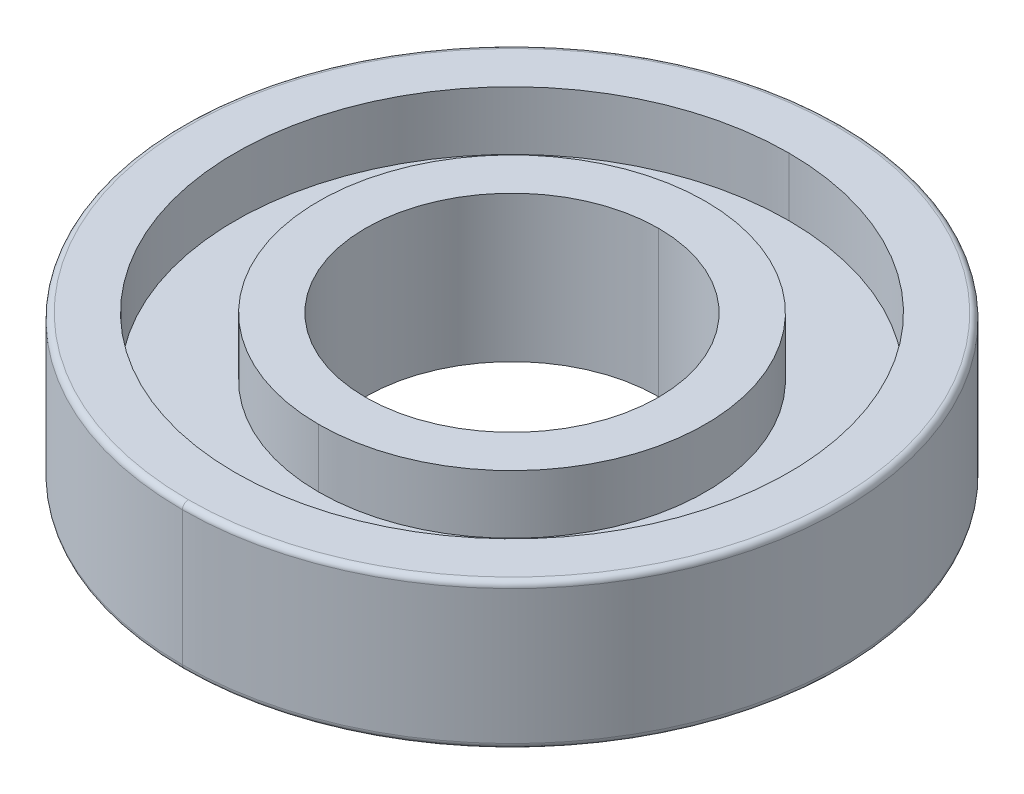
ISO-10303-21;
HEADER;
FILE_DESCRIPTION(('STEP AP214'),'2;1');
FILE_NAME('part.step','',(''),(''),'','','');
FILE_SCHEMA(('AUTOMOTIVE_DESIGN { 1 0 10303 214 1 1 1 1 }'));
ENDSEC;
DATA;
#1=APPLICATION_CONTEXT('core data for automotive mechanical design processes');
#2=APPLICATION_PROTOCOL_DEFINITION('international standard','automotive_design',2000,#1);
#3=PRODUCT_CONTEXT('',#1,'mechanical');
#4=PRODUCT('Part','Part','',(#3));
#5=PRODUCT_RELATED_PRODUCT_CATEGORY('part','',(#4));
#6=PRODUCT_DEFINITION_FORMATION('','',#4);
#7=PRODUCT_DEFINITION_CONTEXT('part definition',#1,'design');
#8=PRODUCT_DEFINITION('design','',#6,#7);
#9=PRODUCT_DEFINITION_SHAPE('','',#8);
#10=(LENGTH_UNIT() NAMED_UNIT(*) SI_UNIT(.MILLI.,.METRE.));
#11=(NAMED_UNIT(*) PLANE_ANGLE_UNIT() SI_UNIT($,.RADIAN.));
#12=(NAMED_UNIT(*) SI_UNIT($,.STERADIAN.) SOLID_ANGLE_UNIT());
#13=UNCERTAINTY_MEASURE_WITH_UNIT(LENGTH_MEASURE(1.E-05),#10,'distance_accuracy_value','');
#14=(GEOMETRIC_REPRESENTATION_CONTEXT(3) GLOBAL_UNCERTAINTY_ASSIGNED_CONTEXT((#13)) GLOBAL_UNIT_ASSIGNED_CONTEXT((#10,
#11,#12)) REPRESENTATION_CONTEXT('',''));
#15=CARTESIAN_POINT('',(0.,0.,0.));
#16=DIRECTION('',(0.,0.,1.));
#17=DIRECTION('',(1.,0.,0.));
#18=AXIS2_PLACEMENT_3D('',#15,#16,#17);
#19=CARTESIAN_POINT('',(0.,6.0706,0.));
#20=DIRECTION('',(0.,1.,0.));
#21=DIRECTION('',(0.,0.,1.));
#22=AXIS2_PLACEMENT_3D('',#19,#20,#21);
#23=TOROIDAL_SURFACE('',#22,14.0335,0.254);
#24=CARTESIAN_POINT('',(0.,6.0706,-14.0335));
#25=DIRECTION('',(1.,0.,0.));
#26=DIRECTION('',(0.,0.,-1.));
#27=AXIS2_PLACEMENT_3D('',#24,#25,#26);
#28=CIRCLE('',#27,0.254);
#29=CARTESIAN_POINT('',(0.,6.0706,-14.2875));
#30=VERTEX_POINT('',#29);
#31=CARTESIAN_POINT('',(0.,6.3246,-14.0335));
#32=VERTEX_POINT('',#31);
#33=EDGE_CURVE('E171',#30,#32,#28,.T.);
#34=ORIENTED_EDGE('',*,*,#33,.F.);
#35=CARTESIAN_POINT('',(0.,6.0706,0.));
#36=DIRECTION('',(0.,-1.,0.));
#37=DIRECTION('',(0.,0.,1.));
#38=AXIS2_PLACEMENT_3D('',#35,#36,#37);
#39=CIRCLE('',#38,14.2875);
#40=CARTESIAN_POINT('',(0.,6.0706,14.2875));
#41=VERTEX_POINT('',#40);
#42=EDGE_CURVE('E144',#41,#30,#39,.T.);
#43=ORIENTED_EDGE('',*,*,#42,.F.);
#44=CARTESIAN_POINT('',(0.,6.0706,14.0335));
#45=DIRECTION('',(-1.,0.,0.));
#46=DIRECTION('',(0.,0.,1.));
#47=AXIS2_PLACEMENT_3D('',#44,#45,#46);
#48=CIRCLE('',#47,0.254);
#49=CARTESIAN_POINT('',(0.,6.3246,14.0335));
#50=VERTEX_POINT('',#49);
#51=EDGE_CURVE('E180',#41,#50,#48,.T.);
#52=ORIENTED_EDGE('',*,*,#51,.T.);
#53=CARTESIAN_POINT('',(0.,6.3246,0.));
#54=DIRECTION('',(0.,1.,0.));
#55=DIRECTION('',(0.,0.,1.));
#56=AXIS2_PLACEMENT_3D('',#53,#54,#55);
#57=CIRCLE('',#56,14.0335);
#58=EDGE_CURVE('E172',#32,#50,#57,.T.);
#59=ORIENTED_EDGE('',*,*,#58,.F.);
#60=EDGE_LOOP('',(#34,#43,#52,#59));
#61=FACE_BOUND('',#60,.T.);
#62=ADVANCED_FACE('F16',(#61),#23,.T.);
#63=CARTESIAN_POINT('',(0.,0.254,0.));
#64=DIRECTION('',(0.,1.,0.));
#65=DIRECTION('',(0.,0.,1.));
#66=AXIS2_PLACEMENT_3D('',#63,#64,#65);
#67=TOROIDAL_SURFACE('',#66,14.0335,0.254);
#68=CARTESIAN_POINT('',(0.,0.254,-14.0335));
#69=DIRECTION('',(1.,0.,0.));
#70=DIRECTION('',(0.,0.,-1.));
#71=AXIS2_PLACEMENT_3D('',#68,#69,#70);
#72=CIRCLE('',#71,0.254);
#73=CARTESIAN_POINT('',(0.,0.,-14.0335));
#74=VERTEX_POINT('',#73);
#75=CARTESIAN_POINT('',(0.,0.254,-14.2875));
#76=VERTEX_POINT('',#75);
#77=EDGE_CURVE('E246',#74,#76,#72,.T.);
#78=ORIENTED_EDGE('',*,*,#77,.F.);
#79=CARTESIAN_POINT('',(0.,0.,0.));
#80=DIRECTION('',(0.,-1.,0.));
#81=DIRECTION('',(0.,0.,1.));
#82=AXIS2_PLACEMENT_3D('',#79,#80,#81);
#83=CIRCLE('',#82,14.0335);
#84=CARTESIAN_POINT('',(0.,0.,14.0335));
#85=VERTEX_POINT('',#84);
#86=EDGE_CURVE('E200',#85,#74,#83,.T.);
#87=ORIENTED_EDGE('',*,*,#86,.F.);
#88=CARTESIAN_POINT('',(0.,0.254,14.0335));
#89=DIRECTION('',(-1.,0.,0.));
#90=DIRECTION('',(0.,0.,1.));
#91=AXIS2_PLACEMENT_3D('',#88,#89,#90);
#92=CIRCLE('',#91,0.254);
#93=CARTESIAN_POINT('',(0.,0.254,14.2875));
#94=VERTEX_POINT('',#93);
#95=EDGE_CURVE('E241',#85,#94,#92,.T.);
#96=ORIENTED_EDGE('',*,*,#95,.T.);
#97=CARTESIAN_POINT('',(0.,0.254,0.));
#98=DIRECTION('',(0.,1.,0.));
#99=DIRECTION('',(0.,0.,1.));
#100=AXIS2_PLACEMENT_3D('',#97,#98,#99);
#101=CIRCLE('',#100,14.2875);
#102=EDGE_CURVE('E156',#76,#94,#101,.T.);
#103=ORIENTED_EDGE('',*,*,#102,.F.);
#104=EDGE_LOOP('',(#78,#87,#96,#103));
#105=FACE_BOUND('',#104,.T.);
#106=ADVANCED_FACE('F330',(#105),#67,.T.);
#107=CARTESIAN_POINT('',(0.,2.54,0.));
#108=DIRECTION('',(0.,-1.,0.));
#109=DIRECTION('',(0.,0.,-1.));
#110=AXIS2_PLACEMENT_3D('',#107,#108,#109);
#111=CYLINDRICAL_SURFACE('',#110,8.382);
#112=DIRECTION('',(0.,-1.,0.));
#113=VECTOR('',#112,1.);
#114=CARTESIAN_POINT('',(0.,2.54,8.382));
#115=LINE('',#114,#113);
#116=CARTESIAN_POINT('',(0.,2.54,8.382));
#117=VERTEX_POINT('',#116);
#118=CARTESIAN_POINT('',(0.,0.,8.382));
#119=VERTEX_POINT('',#118);
#120=EDGE_CURVE('E192',#117,#119,#115,.T.);
#121=ORIENTED_EDGE('',*,*,#120,.F.);
#122=CARTESIAN_POINT('',(0.,2.54,0.));
#123=DIRECTION('',(0.,-1.,0.));
#124=DIRECTION('',(0.,0.,-1.));
#125=AXIS2_PLACEMENT_3D('',#122,#123,#124);
#126=CIRCLE('',#125,8.382);
#127=CARTESIAN_POINT('',(0.,2.54,-8.382));
#128=VERTEX_POINT('',#127);
#129=EDGE_CURVE('E11',#117,#128,#126,.T.);
#130=ORIENTED_EDGE('',*,*,#129,.T.);
#131=DIRECTION('',(0.,-1.,0.));
#132=VECTOR('',#131,1.);
#133=CARTESIAN_POINT('',(0.,2.54,-8.382));
#134=LINE('',#133,#132);
#135=CARTESIAN_POINT('',(0.,0.,-8.382));
#136=VERTEX_POINT('',#135);
#137=EDGE_CURVE('E215',#128,#136,#134,.T.);
#138=ORIENTED_EDGE('',*,*,#137,.T.);
#139=CARTESIAN_POINT('',(0.,0.,0.));
#140=DIRECTION('',(0.,-1.,0.));
#141=DIRECTION('',(0.,0.,-1.));
#142=AXIS2_PLACEMENT_3D('',#139,#140,#141);
#143=CIRCLE('',#142,8.382);
#144=EDGE_CURVE('E168',#119,#136,#143,.T.);
#145=ORIENTED_EDGE('',*,*,#144,.F.);
#146=EDGE_LOOP('',(#121,#130,#138,#145));
#147=FACE_BOUND('',#146,.T.);
#148=ADVANCED_FACE('F350',(#147),#111,.T.);
#149=CARTESIAN_POINT('',(0.,2.54,0.));
#150=DIRECTION('',(0.,-1.,0.));
#151=DIRECTION('',(0.,0.,-1.));
#152=AXIS2_PLACEMENT_3D('',#149,#150,#151);
#153=PLANE('',#152);
#154=CARTESIAN_POINT('',(0.,2.54,0.));
#155=DIRECTION('',(0.,-1.,0.));
#156=DIRECTION('',(0.,0.,-1.));
#157=AXIS2_PLACEMENT_3D('',#154,#155,#156);
#158=CIRCLE('',#157,8.382);
#159=EDGE_CURVE('E197',#128,#117,#158,.T.);
#160=ORIENTED_EDGE('',*,*,#159,.F.);
#161=ORIENTED_EDGE('',*,*,#129,.F.);
#162=EDGE_LOOP('',(#160,#161));
#163=FACE_BOUND('',#162,.T.);
#164=CARTESIAN_POINT('',(0.,2.54,0.));
#165=DIRECTION('',(0.,-1.,0.));
#166=DIRECTION('',(0.,0.,-1.));
#167=AXIS2_PLACEMENT_3D('',#164,#165,#166);
#168=CIRCLE('',#167,12.0015);
#169=CARTESIAN_POINT('',(0.,2.54,-12.0015));
#170=VERTEX_POINT('',#169);
#171=CARTESIAN_POINT('',(0.,2.54,12.0015));
#172=VERTEX_POINT('',#171);
#173=EDGE_CURVE('E27',#170,#172,#168,.T.);
#174=ORIENTED_EDGE('',*,*,#173,.T.);
#175=CARTESIAN_POINT('',(0.,2.54,0.));
#176=DIRECTION('',(0.,-1.,0.));
#177=DIRECTION('',(0.,0.,-1.));
#178=AXIS2_PLACEMENT_3D('',#175,#176,#177);
#179=CIRCLE('',#178,12.0015);
#180=EDGE_CURVE('E210',#172,#170,#179,.T.);
#181=ORIENTED_EDGE('',*,*,#180,.T.);
#182=EDGE_LOOP('',(#174,#181));
#183=FACE_BOUND('',#182,.T.);
#184=ADVANCED_FACE('F364',(#163,#183),#153,.T.);
#185=CARTESIAN_POINT('',(0.,2.54,0.));
#186=DIRECTION('',(0.,-1.,0.));
#187=DIRECTION('',(0.,0.,-1.));
#188=AXIS2_PLACEMENT_3D('',#185,#186,#187);
#189=CYLINDRICAL_SURFACE('',#188,12.0015);
#190=DIRECTION('',(0.,-1.,0.));
#191=VECTOR('',#190,1.);
#192=CARTESIAN_POINT('',(0.,2.54,12.0015));
#193=LINE('',#192,#191);
#194=CARTESIAN_POINT('',(0.,0.,12.0015));
#195=VERTEX_POINT('',#194);
#196=EDGE_CURVE('E214',#172,#195,#193,.T.);
#197=ORIENTED_EDGE('',*,*,#196,.F.);
#198=ORIENTED_EDGE('',*,*,#173,.F.);
#199=DIRECTION('',(0.,-1.,0.));
#200=VECTOR('',#199,1.);
#201=CARTESIAN_POINT('',(0.,2.54,-12.0015));
#202=LINE('',#201,#200);
#203=CARTESIAN_POINT('',(0.,0.,-12.0015));
#204=VERTEX_POINT('',#203);
#205=EDGE_CURVE('E216',#170,#204,#202,.T.);
#206=ORIENTED_EDGE('',*,*,#205,.T.);
#207=CARTESIAN_POINT('',(0.,0.,0.));
#208=DIRECTION('',(0.,-1.,0.));
#209=DIRECTION('',(0.,0.,-1.));
#210=AXIS2_PLACEMENT_3D('',#207,#208,#209);
#211=CIRCLE('',#210,12.0015);
#212=EDGE_CURVE('E157',#204,#195,#211,.T.);
#213=ORIENTED_EDGE('',*,*,#212,.T.);
#214=EDGE_LOOP('',(#197,#198,#206,#213));
#215=FACE_BOUND('',#214,.T.);
#216=ADVANCED_FACE('F319',(#215),#189,.F.);
#217=CARTESIAN_POINT('',(0.,3.7846,0.));
#218=DIRECTION('',(0.,1.,0.));
#219=DIRECTION('',(0.,0.,1.));
#220=AXIS2_PLACEMENT_3D('',#217,#218,#219);
#221=CYLINDRICAL_SURFACE('',#220,8.382);
#222=DIRECTION('',(0.,1.,0.));
#223=VECTOR('',#222,1.);
#224=CARTESIAN_POINT('',(0.,3.7846,-8.382));
#225=LINE('',#224,#223);
#226=CARTESIAN_POINT('',(0.,3.7846,-8.382));
#227=VERTEX_POINT('',#226);
#228=CARTESIAN_POINT('',(0.,6.3246,-8.382));
#229=VERTEX_POINT('',#228);
#230=EDGE_CURVE('E222',#227,#229,#225,.T.);
#231=ORIENTED_EDGE('',*,*,#230,.F.);
#232=CARTESIAN_POINT('',(0.,3.7846,0.));
#233=DIRECTION('',(0.,1.,0.));
#234=DIRECTION('',(0.,0.,1.));
#235=AXIS2_PLACEMENT_3D('',#232,#233,#234);
#236=CIRCLE('',#235,8.382);
#237=CARTESIAN_POINT('',(0.,3.7846,8.382));
#238=VERTEX_POINT('',#237);
#239=EDGE_CURVE('E188',#227,#238,#236,.T.);
#240=ORIENTED_EDGE('',*,*,#239,.T.);
#241=DIRECTION('',(0.,1.,0.));
#242=VECTOR('',#241,1.);
#243=CARTESIAN_POINT('',(0.,3.7846,8.382));
#244=LINE('',#243,#242);
#245=CARTESIAN_POINT('',(0.,6.3246,8.382));
#246=VERTEX_POINT('',#245);
#247=EDGE_CURVE('E233',#238,#246,#244,.T.);
#248=ORIENTED_EDGE('',*,*,#247,.T.);
#249=CARTESIAN_POINT('',(0.,6.3246,0.));
#250=DIRECTION('',(0.,1.,0.));
#251=DIRECTION('',(0.,0.,1.));
#252=AXIS2_PLACEMENT_3D('',#249,#250,#251);
#253=CIRCLE('',#252,8.382);
#254=EDGE_CURVE('E288',#229,#246,#253,.T.);
#255=ORIENTED_EDGE('',*,*,#254,.F.);
#256=EDGE_LOOP('',(#231,#240,#248,#255));
#257=FACE_BOUND('',#256,.T.);
#258=ADVANCED_FACE('F363',(#257),#221,.T.);
#259=CARTESIAN_POINT('',(0.,3.7846,0.));
#260=DIRECTION('',(0.,1.,0.));
#261=DIRECTION('',(1.,0.,0.));
#262=AXIS2_PLACEMENT_3D('',#259,#260,#261);
#263=PLANE('',#262);
#264=CARTESIAN_POINT('',(0.,3.7846,0.));
#265=DIRECTION('',(0.,1.,0.));
#266=DIRECTION('',(0.,0.,1.));
#267=AXIS2_PLACEMENT_3D('',#264,#265,#266);
#268=CIRCLE('',#267,8.382);
#269=EDGE_CURVE('E219',#238,#227,#268,.T.);
#270=ORIENTED_EDGE('',*,*,#269,.F.);
#271=ORIENTED_EDGE('',*,*,#239,.F.);
#272=EDGE_LOOP('',(#270,#271));
#273=FACE_BOUND('',#272,.T.);
#274=CARTESIAN_POINT('',(0.,3.7846,0.));
#275=DIRECTION('',(0.,1.,0.));
#276=DIRECTION('',(0.,0.,1.));
#277=AXIS2_PLACEMENT_3D('',#274,#275,#276);
#278=CIRCLE('',#277,12.0015);
#279=CARTESIAN_POINT('',(0.,3.7846,12.0015));
#280=VERTEX_POINT('',#279);
#281=CARTESIAN_POINT('',(0.,3.7846,-12.0015));
#282=VERTEX_POINT('',#281);
#283=EDGE_CURVE('E191',#280,#282,#278,.T.);
#284=ORIENTED_EDGE('',*,*,#283,.T.);
#285=CARTESIAN_POINT('',(0.,3.7846,0.));
#286=DIRECTION('',(0.,1.,0.));
#287=DIRECTION('',(0.,0.,1.));
#288=AXIS2_PLACEMENT_3D('',#285,#286,#287);
#289=CIRCLE('',#288,12.0015);
#290=EDGE_CURVE('E206',#282,#280,#289,.T.);
#291=ORIENTED_EDGE('',*,*,#290,.T.);
#292=EDGE_LOOP('',(#284,#291));
#293=FACE_BOUND('',#292,.T.);
#294=ADVANCED_FACE('F357',(#273,#293),#263,.T.);
#295=CARTESIAN_POINT('',(0.,3.7846,0.));
#296=DIRECTION('',(0.,1.,0.));
#297=DIRECTION('',(0.,0.,1.));
#298=AXIS2_PLACEMENT_3D('',#295,#296,#297);
#299=CYLINDRICAL_SURFACE('',#298,12.0015);
#300=DIRECTION('',(0.,1.,0.));
#301=VECTOR('',#300,1.);
#302=CARTESIAN_POINT('',(0.,3.7846,-12.0015));
#303=LINE('',#302,#301);
#304=CARTESIAN_POINT('',(0.,6.3246,-12.0015));
#305=VERTEX_POINT('',#304);
#306=EDGE_CURVE('E201',#282,#305,#303,.T.);
#307=ORIENTED_EDGE('',*,*,#306,.F.);
#308=ORIENTED_EDGE('',*,*,#283,.F.);
#309=DIRECTION('',(0.,1.,0.));
#310=VECTOR('',#309,1.);
#311=CARTESIAN_POINT('',(0.,3.7846,12.0015));
#312=LINE('',#311,#310);
#313=CARTESIAN_POINT('',(0.,6.3246,12.0015));
#314=VERTEX_POINT('',#313);
#315=EDGE_CURVE('E259',#280,#314,#312,.T.);
#316=ORIENTED_EDGE('',*,*,#315,.T.);
#317=CARTESIAN_POINT('',(0.,6.3246,0.));
#318=DIRECTION('',(0.,1.,0.));
#319=DIRECTION('',(0.,0.,1.));
#320=AXIS2_PLACEMENT_3D('',#317,#318,#319);
#321=CIRCLE('',#320,12.0015);
#322=EDGE_CURVE('E209',#314,#305,#321,.T.);
#323=ORIENTED_EDGE('',*,*,#322,.T.);
#324=EDGE_LOOP('',(#307,#308,#316,#323));
#325=FACE_BOUND('',#324,.T.);
#326=ADVANCED_FACE('F353',(#325),#299,.F.);
#327=CARTESIAN_POINT('',(0.,6.3246,0.));
#328=DIRECTION('',(0.,-1.,0.));
#329=DIRECTION('',(0.,0.,-1.));
#330=AXIS2_PLACEMENT_3D('',#327,#328,#329);
#331=CYLINDRICAL_SURFACE('',#330,6.35);
#332=DIRECTION('',(0.,-1.,0.));
#333=VECTOR('',#332,1.);
#334=CARTESIAN_POINT('',(0.,6.3246,6.35));
#335=LINE('',#334,#333);
#336=CARTESIAN_POINT('',(0.,6.3246,6.35));
#337=VERTEX_POINT('',#336);
#338=CARTESIAN_POINT('',(0.,0.,6.35));
#339=VERTEX_POINT('',#338);
#340=EDGE_CURVE('E247',#337,#339,#335,.T.);
#341=ORIENTED_EDGE('',*,*,#340,.F.);
#342=CARTESIAN_POINT('',(0.,6.3246,0.));
#343=DIRECTION('',(0.,1.,0.));
#344=DIRECTION('',(0.,0.,1.));
#345=AXIS2_PLACEMENT_3D('',#342,#343,#344);
#346=CIRCLE('',#345,6.35);
#347=CARTESIAN_POINT('',(0.,6.3246,-6.35));
#348=VERTEX_POINT('',#347);
#349=EDGE_CURVE('E20',#337,#348,#346,.T.);
#350=ORIENTED_EDGE('',*,*,#349,.T.);
#351=DIRECTION('',(0.,-1.,0.));
#352=VECTOR('',#351,1.);
#353=CARTESIAN_POINT('',(0.,6.3246,-6.35));
#354=LINE('',#353,#352);
#355=CARTESIAN_POINT('',(0.,0.,-6.35));
#356=VERTEX_POINT('',#355);
#357=EDGE_CURVE('E271',#348,#356,#354,.T.);
#358=ORIENTED_EDGE('',*,*,#357,.T.);
#359=CARTESIAN_POINT('',(0.,0.,0.));
#360=DIRECTION('',(0.,1.,0.));
#361=DIRECTION('',(0.,0.,1.));
#362=AXIS2_PLACEMENT_3D('',#359,#360,#361);
#363=CIRCLE('',#362,6.35);
#364=EDGE_CURVE('E41',#339,#356,#363,.T.);
#365=ORIENTED_EDGE('',*,*,#364,.F.);
#366=EDGE_LOOP('',(#341,#350,#358,#365));
#367=FACE_BOUND('',#366,.T.);
#368=ADVANCED_FACE('F356',(#367),#331,.F.);
#369=CARTESIAN_POINT('',(0.,6.3246,0.));
#370=DIRECTION('',(0.,-1.,0.));
#371=DIRECTION('',(0.,0.,-1.));
#372=AXIS2_PLACEMENT_3D('',#369,#370,#371);
#373=CYLINDRICAL_SURFACE('',#372,14.2875);
#374=DIRECTION('',(0.,-1.,0.));
#375=VECTOR('',#374,1.);
#376=CARTESIAN_POINT('',(0.,6.3246,14.2875));
#377=LINE('',#376,#375);
#378=EDGE_CURVE('E150',#41,#94,#377,.T.);
#379=ORIENTED_EDGE('',*,*,#378,.F.);
#380=ORIENTED_EDGE('',*,*,#42,.T.);
#381=DIRECTION('',(0.,-1.,0.));
#382=VECTOR('',#381,1.);
#383=CARTESIAN_POINT('',(0.,6.3246,-14.2875));
#384=LINE('',#383,#382);
#385=EDGE_CURVE('E147',#30,#76,#384,.T.);
#386=ORIENTED_EDGE('',*,*,#385,.T.);
#387=ORIENTED_EDGE('',*,*,#102,.T.);
#388=EDGE_LOOP('',(#379,#380,#386,#387));
#389=FACE_BOUND('',#388,.T.);
#390=ADVANCED_FACE('F146',(#389),#373,.T.);
#391=CARTESIAN_POINT('',(0.,0.,0.));
#392=DIRECTION('',(0.,1.,0.));
#393=DIRECTION('',(1.,0.,0.));
#394=AXIS2_PLACEMENT_3D('',#391,#392,#393);
#395=PLANE('',#394);
#396=ORIENTED_EDGE('',*,*,#212,.F.);
#397=CARTESIAN_POINT('',(0.,0.,0.));
#398=DIRECTION('',(0.,-1.,0.));
#399=DIRECTION('',(0.,0.,-1.));
#400=AXIS2_PLACEMENT_3D('',#397,#398,#399);
#401=CIRCLE('',#400,12.0015);
#402=EDGE_CURVE('E220',#195,#204,#401,.T.);
#403=ORIENTED_EDGE('',*,*,#402,.F.);
#404=EDGE_LOOP('',(#396,#403));
#405=FACE_BOUND('',#404,.T.);
#406=ORIENTED_EDGE('',*,*,#86,.T.);
#407=CARTESIAN_POINT('',(0.,0.,0.));
#408=DIRECTION('',(0.,-1.,0.));
#409=DIRECTION('',(0.,0.,1.));
#410=AXIS2_PLACEMENT_3D('',#407,#408,#409);
#411=CIRCLE('',#410,14.0335);
#412=EDGE_CURVE('E262',#74,#85,#411,.T.);
#413=ORIENTED_EDGE('',*,*,#412,.T.);
#414=EDGE_LOOP('',(#406,#413));
#415=FACE_BOUND('',#414,.T.);
#416=ADVANCED_FACE('F321',(#405,#415),#395,.F.);
#417=CARTESIAN_POINT('',(0.,6.3246,0.));
#418=DIRECTION('',(0.,1.,0.));
#419=DIRECTION('',(1.,0.,0.));
#420=AXIS2_PLACEMENT_3D('',#417,#418,#419);
#421=PLANE('',#420);
#422=ORIENTED_EDGE('',*,*,#322,.F.);
#423=CARTESIAN_POINT('',(0.,6.3246,0.));
#424=DIRECTION('',(0.,1.,0.));
#425=DIRECTION('',(0.,0.,1.));
#426=AXIS2_PLACEMENT_3D('',#423,#424,#425);
#427=CIRCLE('',#426,12.0015);
#428=EDGE_CURVE('E205',#305,#314,#427,.T.);
#429=ORIENTED_EDGE('',*,*,#428,.F.);
#430=EDGE_LOOP('',(#422,#429));
#431=FACE_BOUND('',#430,.T.);
#432=CARTESIAN_POINT('',(0.,6.3246,0.));
#433=DIRECTION('',(0.,1.,0.));
#434=DIRECTION('',(0.,0.,1.));
#435=AXIS2_PLACEMENT_3D('',#432,#433,#434);
#436=CIRCLE('',#435,14.0335);
#437=EDGE_CURVE('E177',#50,#32,#436,.T.);
#438=ORIENTED_EDGE('',*,*,#437,.T.);
#439=ORIENTED_EDGE('',*,*,#58,.T.);
#440=EDGE_LOOP('',(#438,#439));
#441=FACE_BOUND('',#440,.T.);
#442=ADVANCED_FACE('F324',(#431,#441),#421,.T.);
#443=CARTESIAN_POINT('',(0.,6.3246,0.));
#444=DIRECTION('',(0.,1.,0.));
#445=DIRECTION('',(1.,0.,0.));
#446=AXIS2_PLACEMENT_3D('',#443,#444,#445);
#447=PLANE('',#446);
#448=CARTESIAN_POINT('',(0.,6.3246,0.));
#449=DIRECTION('',(0.,1.,0.));
#450=DIRECTION('',(0.,0.,1.));
#451=AXIS2_PLACEMENT_3D('',#448,#449,#450);
#452=CIRCLE('',#451,6.35);
#453=EDGE_CURVE('E252',#348,#337,#452,.T.);
#454=ORIENTED_EDGE('',*,*,#453,.F.);
#455=ORIENTED_EDGE('',*,*,#349,.F.);
#456=EDGE_LOOP('',(#454,#455));
#457=FACE_BOUND('',#456,.T.);
#458=CARTESIAN_POINT('',(0.,6.3246,0.));
#459=DIRECTION('',(0.,1.,0.));
#460=DIRECTION('',(0.,0.,1.));
#461=AXIS2_PLACEMENT_3D('',#458,#459,#460);
#462=CIRCLE('',#461,8.382);
#463=EDGE_CURVE('E226',#246,#229,#462,.T.);
#464=ORIENTED_EDGE('',*,*,#463,.T.);
#465=ORIENTED_EDGE('',*,*,#254,.T.);
#466=EDGE_LOOP('',(#464,#465));
#467=FACE_BOUND('',#466,.T.);
#468=ADVANCED_FACE('F402',(#457,#467),#447,.T.);
#469=CARTESIAN_POINT('',(0.,0.,0.));
#470=DIRECTION('',(0.,1.,0.));
#471=DIRECTION('',(1.,0.,0.));
#472=AXIS2_PLACEMENT_3D('',#469,#470,#471);
#473=PLANE('',#472);
#474=CARTESIAN_POINT('',(0.,0.,0.));
#475=DIRECTION('',(0.,1.,0.));
#476=DIRECTION('',(0.,0.,1.));
#477=AXIS2_PLACEMENT_3D('',#474,#475,#476);
#478=CIRCLE('',#477,6.35);
#479=EDGE_CURVE('E251',#356,#339,#478,.T.);
#480=ORIENTED_EDGE('',*,*,#479,.T.);
#481=ORIENTED_EDGE('',*,*,#364,.T.);
#482=EDGE_LOOP('',(#480,#481));
#483=FACE_BOUND('',#482,.T.);
#484=CARTESIAN_POINT('',(0.,0.,0.));
#485=DIRECTION('',(0.,-1.,0.));
#486=DIRECTION('',(0.,0.,-1.));
#487=AXIS2_PLACEMENT_3D('',#484,#485,#486);
#488=CIRCLE('',#487,8.382);
#489=EDGE_CURVE('E196',#136,#119,#488,.T.);
#490=ORIENTED_EDGE('',*,*,#489,.T.);
#491=ORIENTED_EDGE('',*,*,#144,.T.);
#492=EDGE_LOOP('',(#490,#491));
#493=FACE_BOUND('',#492,.T.);
#494=ADVANCED_FACE('F18',(#483,#493),#473,.F.);
#495=CARTESIAN_POINT('',(0.,6.3246,0.));
#496=DIRECTION('',(0.,-1.,0.));
#497=DIRECTION('',(0.,0.,-1.));
#498=AXIS2_PLACEMENT_3D('',#495,#496,#497);
#499=CYLINDRICAL_SURFACE('',#498,14.2875);
#500=CARTESIAN_POINT('',(0.,6.0706,0.));
#501=DIRECTION('',(0.,-1.,0.));
#502=DIRECTION('',(0.,0.,1.));
#503=AXIS2_PLACEMENT_3D('',#500,#501,#502);
#504=CIRCLE('',#503,14.2875);
#505=EDGE_CURVE('E163',#30,#41,#504,.T.);
#506=ORIENTED_EDGE('',*,*,#505,.T.);
#507=ORIENTED_EDGE('',*,*,#378,.T.);
#508=CARTESIAN_POINT('',(0.,0.254,0.));
#509=DIRECTION('',(0.,1.,0.));
#510=DIRECTION('',(0.,0.,1.));
#511=AXIS2_PLACEMENT_3D('',#508,#509,#510);
#512=CIRCLE('',#511,14.2875);
#513=EDGE_CURVE('E165',#94,#76,#512,.T.);
#514=ORIENTED_EDGE('',*,*,#513,.T.);
#515=ORIENTED_EDGE('',*,*,#385,.F.);
#516=EDGE_LOOP('',(#506,#507,#514,#515));
#517=FACE_BOUND('',#516,.T.);
#518=ADVANCED_FACE('F161',(#517),#499,.T.);
#519=CARTESIAN_POINT('',(0.,6.3246,0.));
#520=DIRECTION('',(0.,-1.,0.));
#521=DIRECTION('',(0.,0.,-1.));
#522=AXIS2_PLACEMENT_3D('',#519,#520,#521);
#523=CYLINDRICAL_SURFACE('',#522,6.35);
#524=ORIENTED_EDGE('',*,*,#453,.T.);
#525=ORIENTED_EDGE('',*,*,#340,.T.);
#526=ORIENTED_EDGE('',*,*,#479,.F.);
#527=ORIENTED_EDGE('',*,*,#357,.F.);
#528=EDGE_LOOP('',(#524,#525,#526,#527));
#529=FACE_BOUND('',#528,.T.);
#530=ADVANCED_FACE('F368',(#529),#523,.F.);
#531=CARTESIAN_POINT('',(0.,3.7846,0.));
#532=DIRECTION('',(0.,1.,0.));
#533=DIRECTION('',(0.,0.,1.));
#534=AXIS2_PLACEMENT_3D('',#531,#532,#533);
#535=CYLINDRICAL_SURFACE('',#534,12.0015);
#536=ORIENTED_EDGE('',*,*,#290,.F.);
#537=ORIENTED_EDGE('',*,*,#306,.T.);
#538=ORIENTED_EDGE('',*,*,#428,.T.);
#539=ORIENTED_EDGE('',*,*,#315,.F.);
#540=EDGE_LOOP('',(#536,#537,#538,#539));
#541=FACE_BOUND('',#540,.T.);
#542=ADVANCED_FACE('F365',(#541),#535,.F.);
#543=CARTESIAN_POINT('',(0.,3.7846,0.));
#544=DIRECTION('',(0.,1.,0.));
#545=DIRECTION('',(0.,0.,1.));
#546=AXIS2_PLACEMENT_3D('',#543,#544,#545);
#547=CYLINDRICAL_SURFACE('',#546,8.382);
#548=ORIENTED_EDGE('',*,*,#269,.T.);
#549=ORIENTED_EDGE('',*,*,#230,.T.);
#550=ORIENTED_EDGE('',*,*,#463,.F.);
#551=ORIENTED_EDGE('',*,*,#247,.F.);
#552=EDGE_LOOP('',(#548,#549,#550,#551));
#553=FACE_BOUND('',#552,.T.);
#554=ADVANCED_FACE('F367',(#553),#547,.T.);
#555=CARTESIAN_POINT('',(0.,2.54,0.));
#556=DIRECTION('',(0.,-1.,0.));
#557=DIRECTION('',(0.,0.,-1.));
#558=AXIS2_PLACEMENT_3D('',#555,#556,#557);
#559=CYLINDRICAL_SURFACE('',#558,12.0015);
#560=ORIENTED_EDGE('',*,*,#180,.F.);
#561=ORIENTED_EDGE('',*,*,#196,.T.);
#562=ORIENTED_EDGE('',*,*,#402,.T.);
#563=ORIENTED_EDGE('',*,*,#205,.F.);
#564=EDGE_LOOP('',(#560,#561,#562,#563));
#565=FACE_BOUND('',#564,.T.);
#566=ADVANCED_FACE('F315',(#565),#559,.F.);
#567=CARTESIAN_POINT('',(0.,2.54,0.));
#568=DIRECTION('',(0.,-1.,0.));
#569=DIRECTION('',(0.,0.,-1.));
#570=AXIS2_PLACEMENT_3D('',#567,#568,#569);
#571=CYLINDRICAL_SURFACE('',#570,8.382);
#572=ORIENTED_EDGE('',*,*,#159,.T.);
#573=ORIENTED_EDGE('',*,*,#120,.T.);
#574=ORIENTED_EDGE('',*,*,#489,.F.);
#575=ORIENTED_EDGE('',*,*,#137,.F.);
#576=EDGE_LOOP('',(#572,#573,#574,#575));
#577=FACE_BOUND('',#576,.T.);
#578=ADVANCED_FACE('F334',(#577),#571,.T.);
#579=CARTESIAN_POINT('',(0.,0.254,0.));
#580=DIRECTION('',(0.,1.,0.));
#581=DIRECTION('',(0.,0.,1.));
#582=AXIS2_PLACEMENT_3D('',#579,#580,#581);
#583=TOROIDAL_SURFACE('',#582,14.0335,0.254);
#584=ORIENTED_EDGE('',*,*,#412,.F.);
#585=ORIENTED_EDGE('',*,*,#77,.T.);
#586=ORIENTED_EDGE('',*,*,#513,.F.);
#587=ORIENTED_EDGE('',*,*,#95,.F.);
#588=EDGE_LOOP('',(#584,#585,#586,#587));
#589=FACE_BOUND('',#588,.T.);
#590=ADVANCED_FACE('F332',(#589),#583,.T.);
#591=CARTESIAN_POINT('',(0.,6.0706,0.));
#592=DIRECTION('',(0.,1.,0.));
#593=DIRECTION('',(0.,0.,1.));
#594=AXIS2_PLACEMENT_3D('',#591,#592,#593);
#595=TOROIDAL_SURFACE('',#594,14.0335,0.254);
#596=ORIENTED_EDGE('',*,*,#505,.F.);
#597=ORIENTED_EDGE('',*,*,#33,.T.);
#598=ORIENTED_EDGE('',*,*,#437,.F.);
#599=ORIENTED_EDGE('',*,*,#51,.F.);
#600=EDGE_LOOP('',(#596,#597,#598,#599));
#601=FACE_BOUND('',#600,.T.);
#602=ADVANCED_FACE('F179',(#601),#595,.T.);
#603=CLOSED_SHELL('',(#62,#106,#148,#184,#216,#258,#294,#326,#368,#390,#416,#442,#468,#494,#518,
#530,#542,#554,#566,#578,#590,#602));
#604=MANIFOLD_SOLID_BREP('B1',#603);
#605=ADVANCED_BREP_SHAPE_REPRESENTATION('',(#18,#604),#14);
#606=SHAPE_DEFINITION_REPRESENTATION(#9,#605);
ENDSEC;
END-ISO-10303-21;
